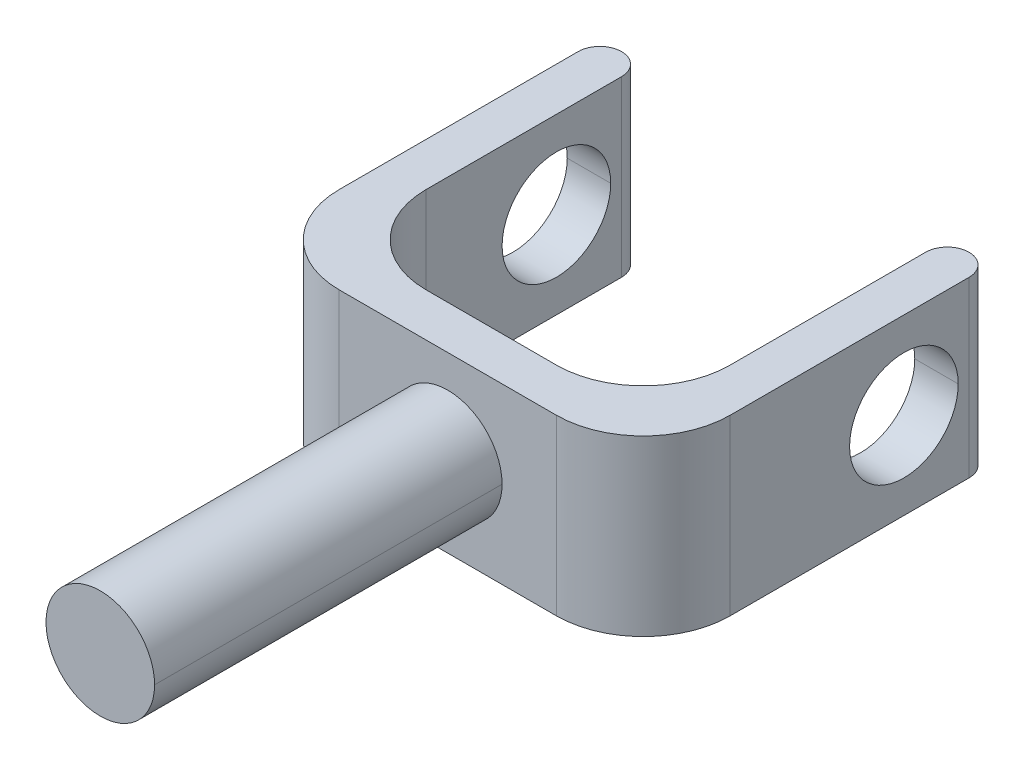
ISO-10303-21;
HEADER;
FILE_DESCRIPTION(('STEP AP214'),'2;1');
FILE_NAME('part.step','',(''),(''),'','','');
FILE_SCHEMA(('AUTOMOTIVE_DESIGN { 1 0 10303 214 1 1 1 1 }'));
ENDSEC;
DATA;
#1=APPLICATION_CONTEXT('core data for automotive mechanical design processes');
#2=APPLICATION_PROTOCOL_DEFINITION('international standard','automotive_design',2000,#1);
#3=PRODUCT_CONTEXT('',#1,'mechanical');
#4=PRODUCT('Part','Part','',(#3));
#5=PRODUCT_RELATED_PRODUCT_CATEGORY('part','',(#4));
#6=PRODUCT_DEFINITION_FORMATION('','',#4);
#7=PRODUCT_DEFINITION_CONTEXT('part definition',#1,'design');
#8=PRODUCT_DEFINITION('design','',#6,#7);
#9=PRODUCT_DEFINITION_SHAPE('','',#8);
#10=(LENGTH_UNIT() NAMED_UNIT(*) SI_UNIT(.MILLI.,.METRE.));
#11=(NAMED_UNIT(*) PLANE_ANGLE_UNIT() SI_UNIT($,.RADIAN.));
#12=(NAMED_UNIT(*) SI_UNIT($,.STERADIAN.) SOLID_ANGLE_UNIT());
#13=UNCERTAINTY_MEASURE_WITH_UNIT(LENGTH_MEASURE(1.E-05),#10,'distance_accuracy_value','');
#14=(GEOMETRIC_REPRESENTATION_CONTEXT(3) GLOBAL_UNCERTAINTY_ASSIGNED_CONTEXT((#13)) GLOBAL_UNIT_ASSIGNED_CONTEXT((#10,
#11,#12)) REPRESENTATION_CONTEXT('',''));
#15=CARTESIAN_POINT('',(0.,0.,0.));
#16=DIRECTION('',(0.,0.,1.));
#17=DIRECTION('',(1.,0.,0.));
#18=AXIS2_PLACEMENT_3D('',#15,#16,#17);
#19=CARTESIAN_POINT('',(-45.,0.,-55.));
#20=DIRECTION('',(1.,0.,0.));
#21=DIRECTION('',(0.,0.,-1.));
#22=AXIS2_PLACEMENT_3D('',#19,#20,#21);
#23=CYLINDRICAL_SURFACE('',#22,12.5);
#24=CARTESIAN_POINT('',(-45.,0.,-55.));
#25=DIRECTION('',(1.,0.,0.));
#26=DIRECTION('',(0.,0.,-1.));
#27=AXIS2_PLACEMENT_3D('',#24,#25,#26);
#28=CIRCLE('',#27,12.5);
#29=CARTESIAN_POINT('',(-45.,0.,-42.5));
#30=VERTEX_POINT('',#29);
#31=CARTESIAN_POINT('',(-45.,0.,-67.5));
#32=VERTEX_POINT('',#31);
#33=EDGE_CURVE('E295',#30,#32,#28,.T.);
#34=ORIENTED_EDGE('',*,*,#33,.F.);
#35=DIRECTION('',(1.,0.,0.));
#36=VECTOR('',#35,1.);
#37=CARTESIAN_POINT('',(-45.,0.,-42.5));
#38=LINE('',#37,#36);
#39=CARTESIAN_POINT('',(-35.,0.,-42.5));
#40=VERTEX_POINT('',#39);
#41=EDGE_CURVE('E379',#30,#40,#38,.T.);
#42=ORIENTED_EDGE('',*,*,#41,.T.);
#43=CARTESIAN_POINT('',(-35.,0.,-55.));
#44=DIRECTION('',(-1.,0.,0.));
#45=DIRECTION('',(0.,0.,1.));
#46=AXIS2_PLACEMENT_3D('',#43,#44,#45);
#47=CIRCLE('',#46,12.5);
#48=CARTESIAN_POINT('',(-35.,0.,-67.5));
#49=VERTEX_POINT('',#48);
#50=EDGE_CURVE('E9',#49,#40,#47,.T.);
#51=ORIENTED_EDGE('',*,*,#50,.F.);
#52=DIRECTION('',(1.,0.,0.));
#53=VECTOR('',#52,1.);
#54=CARTESIAN_POINT('',(-45.,0.,-67.5));
#55=LINE('',#54,#53);
#56=EDGE_CURVE('E321',#32,#49,#55,.T.);
#57=ORIENTED_EDGE('',*,*,#56,.F.);
#58=EDGE_LOOP('',(#34,#42,#51,#57));
#59=FACE_BOUND('',#58,.T.);
#60=ADVANCED_FACE('F15',(#59),#23,.F.);
#61=CARTESIAN_POINT('',(-45.,0.,-55.));
#62=DIRECTION('',(1.,0.,0.));
#63=DIRECTION('',(0.,0.,-1.));
#64=AXIS2_PLACEMENT_3D('',#61,#62,#63);
#65=CYLINDRICAL_SURFACE('',#64,12.5);
#66=CARTESIAN_POINT('',(35.,0.,-55.));
#67=DIRECTION('',(-1.,0.,0.));
#68=DIRECTION('',(0.,0.,1.));
#69=AXIS2_PLACEMENT_3D('',#66,#67,#68);
#70=CIRCLE('',#69,12.5);
#71=CARTESIAN_POINT('',(35.,0.,-67.5));
#72=VERTEX_POINT('',#71);
#73=CARTESIAN_POINT('',(35.,0.,-42.5));
#74=VERTEX_POINT('',#73);
#75=EDGE_CURVE('E252',#72,#74,#70,.T.);
#76=ORIENTED_EDGE('',*,*,#75,.T.);
#77=DIRECTION('',(1.,0.,0.));
#78=VECTOR('',#77,1.);
#79=CARTESIAN_POINT('',(-45.,0.,-42.5));
#80=LINE('',#79,#78);
#81=CARTESIAN_POINT('',(45.,0.,-42.5));
#82=VERTEX_POINT('',#81);
#83=EDGE_CURVE('E282',#74,#82,#80,.T.);
#84=ORIENTED_EDGE('',*,*,#83,.T.);
#85=CARTESIAN_POINT('',(45.,0.,-55.));
#86=DIRECTION('',(1.,0.,0.));
#87=DIRECTION('',(0.,0.,-1.));
#88=AXIS2_PLACEMENT_3D('',#85,#86,#87);
#89=CIRCLE('',#88,12.5);
#90=CARTESIAN_POINT('',(45.,0.,-67.5));
#91=VERTEX_POINT('',#90);
#92=EDGE_CURVE('E201',#82,#91,#89,.T.);
#93=ORIENTED_EDGE('',*,*,#92,.T.);
#94=DIRECTION('',(1.,0.,0.));
#95=VECTOR('',#94,1.);
#96=CARTESIAN_POINT('',(-45.,0.,-67.5));
#97=LINE('',#96,#95);
#98=EDGE_CURVE('E317',#72,#91,#97,.T.);
#99=ORIENTED_EDGE('',*,*,#98,.F.);
#100=EDGE_LOOP('',(#76,#84,#93,#99));
#101=FACE_BOUND('',#100,.T.);
#102=ADVANCED_FACE('F450',(#101),#65,.F.);
#103=CARTESIAN_POINT('',(0.,0.,85.));
#104=DIRECTION('',(0.,0.,-1.));
#105=DIRECTION('',(-1.,0.,0.));
#106=AXIS2_PLACEMENT_3D('',#103,#104,#105);
#107=CYLINDRICAL_SURFACE('',#106,12.5);
#108=CARTESIAN_POINT('',(0.,0.,85.));
#109=DIRECTION('',(0.,0.,1.));
#110=DIRECTION('',(1.,0.,0.));
#111=AXIS2_PLACEMENT_3D('',#108,#109,#110);
#112=CIRCLE('',#111,12.5);
#113=CARTESIAN_POINT('',(12.5,0.,85.));
#114=VERTEX_POINT('',#113);
#115=CARTESIAN_POINT('',(-12.5,0.,85.));
#116=VERTEX_POINT('',#115);
#117=EDGE_CURVE('E242',#114,#116,#112,.T.);
#118=ORIENTED_EDGE('',*,*,#117,.F.);
#119=DIRECTION('',(0.,0.,-1.));
#120=VECTOR('',#119,1.);
#121=CARTESIAN_POINT('',(12.5,0.,85.));
#122=LINE('',#121,#120);
#123=CARTESIAN_POINT('',(12.5,0.,5.));
#124=VERTEX_POINT('',#123);
#125=EDGE_CURVE('E270',#114,#124,#122,.T.);
#126=ORIENTED_EDGE('',*,*,#125,.T.);
#127=CARTESIAN_POINT('',(0.,0.,5.));
#128=DIRECTION('',(0.,0.,1.));
#129=DIRECTION('',(1.,0.,0.));
#130=AXIS2_PLACEMENT_3D('',#127,#128,#129);
#131=CIRCLE('',#130,12.5);
#132=CARTESIAN_POINT('',(-12.5,0.,5.));
#133=VERTEX_POINT('',#132);
#134=EDGE_CURVE('E231',#124,#133,#131,.T.);
#135=ORIENTED_EDGE('',*,*,#134,.T.);
#136=DIRECTION('',(0.,0.,-1.));
#137=VECTOR('',#136,1.);
#138=CARTESIAN_POINT('',(-12.5,0.,85.));
#139=LINE('',#138,#137);
#140=EDGE_CURVE('E248',#116,#133,#139,.T.);
#141=ORIENTED_EDGE('',*,*,#140,.F.);
#142=EDGE_LOOP('',(#118,#126,#135,#141));
#143=FACE_BOUND('',#142,.T.);
#144=ADVANCED_FACE('F610',(#143),#107,.T.);
#145=CARTESIAN_POINT('',(40.,20.,-70.));
#146=DIRECTION('',(0.,-1.,0.));
#147=DIRECTION('',(0.,0.,-1.));
#148=AXIS2_PLACEMENT_3D('',#145,#146,#147);
#149=CYLINDRICAL_SURFACE('',#148,5.);
#150=CARTESIAN_POINT('',(40.,20.,-70.));
#151=DIRECTION('',(0.,-1.,0.));
#152=DIRECTION('',(0.,0.,1.));
#153=AXIS2_PLACEMENT_3D('',#150,#151,#152);
#154=CIRCLE('',#153,5.);
#155=CARTESIAN_POINT('',(35.,20.,-70.));
#156=VERTEX_POINT('',#155);
#157=CARTESIAN_POINT('',(40.,20.,-75.));
#158=VERTEX_POINT('',#157);
#159=EDGE_CURVE('E211',#156,#158,#154,.T.);
#160=ORIENTED_EDGE('',*,*,#159,.T.);
#161=DIRECTION('',(0.,-1.,0.));
#162=VECTOR('',#161,1.);
#163=CARTESIAN_POINT('',(40.,20.,-75.));
#164=LINE('',#163,#162);
#165=CARTESIAN_POINT('',(40.,-20.,-75.));
#166=VERTEX_POINT('',#165);
#167=EDGE_CURVE('E202',#158,#166,#164,.T.);
#168=ORIENTED_EDGE('',*,*,#167,.T.);
#169=CARTESIAN_POINT('',(40.,-20.,-70.));
#170=DIRECTION('',(0.,-1.,0.));
#171=DIRECTION('',(0.,0.,1.));
#172=AXIS2_PLACEMENT_3D('',#169,#170,#171);
#173=CIRCLE('',#172,5.);
#174=CARTESIAN_POINT('',(35.,-20.,-70.));
#175=VERTEX_POINT('',#174);
#176=EDGE_CURVE('E307',#175,#166,#173,.T.);
#177=ORIENTED_EDGE('',*,*,#176,.F.);
#178=DIRECTION('',(0.,-1.,0.));
#179=VECTOR('',#178,1.);
#180=CARTESIAN_POINT('',(35.,20.,-70.));
#181=LINE('',#180,#179);
#182=EDGE_CURVE('E249',#156,#175,#181,.T.);
#183=ORIENTED_EDGE('',*,*,#182,.F.);
#184=EDGE_LOOP('',(#160,#168,#177,#183));
#185=FACE_BOUND('',#184,.T.);
#186=ADVANCED_FACE('F664',(#185),#149,.T.);
#187=CARTESIAN_POINT('',(-40.,20.,-70.));
#188=DIRECTION('',(0.,-1.,0.));
#189=DIRECTION('',(0.,0.,-1.));
#190=AXIS2_PLACEMENT_3D('',#187,#188,#189);
#191=CYLINDRICAL_SURFACE('',#190,5.);
#192=CARTESIAN_POINT('',(-40.,20.,-70.));
#193=DIRECTION('',(0.,1.,0.));
#194=DIRECTION('',(0.,0.,1.));
#195=AXIS2_PLACEMENT_3D('',#192,#193,#194);
#196=CIRCLE('',#195,5.);
#197=CARTESIAN_POINT('',(-40.,20.,-75.));
#198=VERTEX_POINT('',#197);
#199=CARTESIAN_POINT('',(-45.,20.,-70.));
#200=VERTEX_POINT('',#199);
#201=EDGE_CURVE('E265',#198,#200,#196,.T.);
#202=ORIENTED_EDGE('',*,*,#201,.F.);
#203=DIRECTION('',(0.,-1.,0.));
#204=VECTOR('',#203,1.);
#205=CARTESIAN_POINT('',(-40.,20.,-75.));
#206=LINE('',#205,#204);
#207=CARTESIAN_POINT('',(-40.,-20.,-75.));
#208=VERTEX_POINT('',#207);
#209=EDGE_CURVE('E293',#198,#208,#206,.T.);
#210=ORIENTED_EDGE('',*,*,#209,.T.);
#211=CARTESIAN_POINT('',(-40.,-20.,-70.));
#212=DIRECTION('',(0.,1.,0.));
#213=DIRECTION('',(0.,0.,1.));
#214=AXIS2_PLACEMENT_3D('',#211,#212,#213);
#215=CIRCLE('',#214,5.);
#216=CARTESIAN_POINT('',(-45.,-20.,-70.));
#217=VERTEX_POINT('',#216);
#218=EDGE_CURVE('E302',#208,#217,#215,.T.);
#219=ORIENTED_EDGE('',*,*,#218,.T.);
#220=DIRECTION('',(0.,-1.,0.));
#221=VECTOR('',#220,1.);
#222=CARTESIAN_POINT('',(-45.,20.,-70.));
#223=LINE('',#222,#221);
#224=EDGE_CURVE('E41',#200,#217,#223,.T.);
#225=ORIENTED_EDGE('',*,*,#224,.F.);
#226=EDGE_LOOP('',(#202,#210,#219,#225));
#227=FACE_BOUND('',#226,.T.);
#228=ADVANCED_FACE('F670',(#227),#191,.T.);
#229=CARTESIAN_POINT('',(-35.,20.,0.));
#230=DIRECTION('',(-1.,0.,0.));
#231=DIRECTION('',(0.,0.,1.));
#232=AXIS2_PLACEMENT_3D('',#229,#230,#231);
#233=PLANE('',#232);
#234=ORIENTED_EDGE('',*,*,#50,.T.);
#235=CARTESIAN_POINT('',(-35.,0.,-55.));
#236=DIRECTION('',(-1.,0.,0.));
#237=DIRECTION('',(0.,0.,1.));
#238=AXIS2_PLACEMENT_3D('',#235,#236,#237);
#239=CIRCLE('',#238,12.5);
#240=EDGE_CURVE('E287',#40,#49,#239,.T.);
#241=ORIENTED_EDGE('',*,*,#240,.T.);
#242=EDGE_LOOP('',(#234,#241));
#243=FACE_BOUND('',#242,.T.);
#244=DIRECTION('',(0.,0.,-1.));
#245=VECTOR('',#244,1.);
#246=CARTESIAN_POINT('',(-35.,20.,0.));
#247=LINE('',#246,#245);
#248=CARTESIAN_POINT('',(-35.,20.,-25.));
#249=VERTEX_POINT('',#248);
#250=CARTESIAN_POINT('',(-35.,20.,-70.));
#251=VERTEX_POINT('',#250);
#252=EDGE_CURVE('E306',#249,#251,#247,.T.);
#253=ORIENTED_EDGE('',*,*,#252,.F.);
#254=DIRECTION('',(0.,-1.,0.));
#255=VECTOR('',#254,1.);
#256=CARTESIAN_POINT('',(-35.,20.,-25.));
#257=LINE('',#256,#255);
#258=CARTESIAN_POINT('',(-35.,-20.,-25.));
#259=VERTEX_POINT('',#258);
#260=EDGE_CURVE('E236',#249,#259,#257,.T.);
#261=ORIENTED_EDGE('',*,*,#260,.T.);
#262=DIRECTION('',(0.,0.,-1.));
#263=VECTOR('',#262,1.);
#264=CARTESIAN_POINT('',(-35.,-20.,0.));
#265=LINE('',#264,#263);
#266=CARTESIAN_POINT('',(-35.,-20.,-70.));
#267=VERTEX_POINT('',#266);
#268=EDGE_CURVE('E138',#259,#267,#265,.T.);
#269=ORIENTED_EDGE('',*,*,#268,.T.);
#270=DIRECTION('',(0.,-1.,0.));
#271=VECTOR('',#270,1.);
#272=CARTESIAN_POINT('',(-35.,20.,-70.));
#273=LINE('',#272,#271);
#274=EDGE_CURVE('E26',#251,#267,#273,.T.);
#275=ORIENTED_EDGE('',*,*,#274,.F.);
#276=EDGE_LOOP('',(#253,#261,#269,#275));
#277=FACE_BOUND('',#276,.T.);
#278=ADVANCED_FACE('F369',(#243,#277),#233,.F.);
#279=CARTESIAN_POINT('',(-40.,20.,-70.));
#280=DIRECTION('',(0.,-1.,0.));
#281=DIRECTION('',(0.,0.,-1.));
#282=AXIS2_PLACEMENT_3D('',#279,#280,#281);
#283=CYLINDRICAL_SURFACE('',#282,5.);
#284=ORIENTED_EDGE('',*,*,#209,.F.);
#285=CARTESIAN_POINT('',(-40.,20.,-70.));
#286=DIRECTION('',(0.,1.,0.));
#287=DIRECTION('',(0.,0.,1.));
#288=AXIS2_PLACEMENT_3D('',#285,#286,#287);
#289=CIRCLE('',#288,5.);
#290=EDGE_CURVE('E269',#251,#198,#289,.T.);
#291=ORIENTED_EDGE('',*,*,#290,.F.);
#292=ORIENTED_EDGE('',*,*,#274,.T.);
#293=CARTESIAN_POINT('',(-40.,-20.,-70.));
#294=DIRECTION('',(0.,1.,0.));
#295=DIRECTION('',(0.,0.,1.));
#296=AXIS2_PLACEMENT_3D('',#293,#294,#295);
#297=CIRCLE('',#296,5.);
#298=EDGE_CURVE('E281',#267,#208,#297,.T.);
#299=ORIENTED_EDGE('',*,*,#298,.T.);
#300=EDGE_LOOP('',(#284,#291,#292,#299));
#301=FACE_BOUND('',#300,.T.);
#302=ADVANCED_FACE('F579',(#301),#283,.T.);
#303=CARTESIAN_POINT('',(-45.,20.,0.));
#304=DIRECTION('',(-1.,0.,0.));
#305=DIRECTION('',(0.,0.,1.));
#306=AXIS2_PLACEMENT_3D('',#303,#304,#305);
#307=PLANE('',#306);
#308=CARTESIAN_POINT('',(-45.,0.,-55.));
#309=DIRECTION('',(1.,0.,0.));
#310=DIRECTION('',(0.,0.,-1.));
#311=AXIS2_PLACEMENT_3D('',#308,#309,#310);
#312=CIRCLE('',#311,12.5);
#313=EDGE_CURVE('E325',#32,#30,#312,.T.);
#314=ORIENTED_EDGE('',*,*,#313,.T.);
#315=ORIENTED_EDGE('',*,*,#33,.T.);
#316=EDGE_LOOP('',(#314,#315));
#317=FACE_BOUND('',#316,.T.);
#318=DIRECTION('',(0.,0.,-1.));
#319=VECTOR('',#318,1.);
#320=CARTESIAN_POINT('',(-45.,-20.,0.));
#321=LINE('',#320,#319);
#322=CARTESIAN_POINT('',(-45.,-20.,-15.));
#323=VERTEX_POINT('',#322);
#324=EDGE_CURVE('E257',#323,#217,#321,.T.);
#325=ORIENTED_EDGE('',*,*,#324,.F.);
#326=DIRECTION('',(0.,1.,0.));
#327=VECTOR('',#326,1.);
#328=CARTESIAN_POINT('',(-45.,20.,-15.));
#329=LINE('',#328,#327);
#330=CARTESIAN_POINT('',(-45.,20.,-15.));
#331=VERTEX_POINT('',#330);
#332=EDGE_CURVE('E359',#323,#331,#329,.T.);
#333=ORIENTED_EDGE('',*,*,#332,.T.);
#334=DIRECTION('',(0.,0.,-1.));
#335=VECTOR('',#334,1.);
#336=CARTESIAN_POINT('',(-45.,20.,0.));
#337=LINE('',#336,#335);
#338=EDGE_CURVE('E253',#331,#200,#337,.T.);
#339=ORIENTED_EDGE('',*,*,#338,.T.);
#340=ORIENTED_EDGE('',*,*,#224,.T.);
#341=EDGE_LOOP('',(#325,#333,#339,#340));
#342=FACE_BOUND('',#341,.T.);
#343=ADVANCED_FACE('F574',(#317,#342),#307,.T.);
#344=CARTESIAN_POINT('',(0.,20.,5.));
#345=DIRECTION('',(0.,0.,-1.));
#346=DIRECTION('',(0.,-1.,0.));
#347=AXIS2_PLACEMENT_3D('',#344,#345,#346);
#348=PLANE('',#347);
#349=CARTESIAN_POINT('',(0.,0.,5.));
#350=DIRECTION('',(0.,0.,1.));
#351=DIRECTION('',(1.,0.,0.));
#352=AXIS2_PLACEMENT_3D('',#349,#350,#351);
#353=CIRCLE('',#352,12.5);
#354=EDGE_CURVE('E244',#133,#124,#353,.T.);
#355=ORIENTED_EDGE('',*,*,#354,.F.);
#356=ORIENTED_EDGE('',*,*,#134,.F.);
#357=EDGE_LOOP('',(#355,#356));
#358=FACE_BOUND('',#357,.T.);
#359=DIRECTION('',(1.,0.,0.));
#360=VECTOR('',#359,1.);
#361=CARTESIAN_POINT('',(0.,-20.,5.));
#362=LINE('',#361,#360);
#363=CARTESIAN_POINT('',(-25.,-20.,5.));
#364=VERTEX_POINT('',#363);
#365=CARTESIAN_POINT('',(25.,-20.,5.));
#366=VERTEX_POINT('',#365);
#367=EDGE_CURVE('E254',#364,#366,#362,.T.);
#368=ORIENTED_EDGE('',*,*,#367,.T.);
#369=DIRECTION('',(0.,1.,0.));
#370=VECTOR('',#369,1.);
#371=CARTESIAN_POINT('',(25.,20.,5.));
#372=LINE('',#371,#370);
#373=CARTESIAN_POINT('',(25.,20.,5.));
#374=VERTEX_POINT('',#373);
#375=EDGE_CURVE('E19',#366,#374,#372,.T.);
#376=ORIENTED_EDGE('',*,*,#375,.T.);
#377=DIRECTION('',(1.,0.,0.));
#378=VECTOR('',#377,1.);
#379=CARTESIAN_POINT('',(0.,20.,5.));
#380=LINE('',#379,#378);
#381=CARTESIAN_POINT('',(-25.,20.,5.));
#382=VERTEX_POINT('',#381);
#383=EDGE_CURVE('E218',#382,#374,#380,.T.);
#384=ORIENTED_EDGE('',*,*,#383,.F.);
#385=DIRECTION('',(0.,-1.,0.));
#386=VECTOR('',#385,1.);
#387=CARTESIAN_POINT('',(-25.,-20.,5.));
#388=LINE('',#387,#386);
#389=EDGE_CURVE('E292',#382,#364,#388,.T.);
#390=ORIENTED_EDGE('',*,*,#389,.T.);
#391=EDGE_LOOP('',(#368,#376,#384,#390));
#392=FACE_BOUND('',#391,.T.);
#393=ADVANCED_FACE('F578',(#358,#392),#348,.F.);
#394=CARTESIAN_POINT('',(45.,20.,0.));
#395=DIRECTION('',(-1.,0.,0.));
#396=DIRECTION('',(0.,1.,0.));
#397=AXIS2_PLACEMENT_3D('',#394,#395,#396);
#398=PLANE('',#397);
#399=CARTESIAN_POINT('',(45.,0.,-55.));
#400=DIRECTION('',(1.,0.,0.));
#401=DIRECTION('',(0.,0.,-1.));
#402=AXIS2_PLACEMENT_3D('',#399,#400,#401);
#403=CIRCLE('',#402,12.5);
#404=EDGE_CURVE('E312',#91,#82,#403,.T.);
#405=ORIENTED_EDGE('',*,*,#404,.F.);
#406=ORIENTED_EDGE('',*,*,#92,.F.);
#407=EDGE_LOOP('',(#405,#406));
#408=FACE_BOUND('',#407,.T.);
#409=DIRECTION('',(0.,0.,-1.));
#410=VECTOR('',#409,1.);
#411=CARTESIAN_POINT('',(45.,20.,0.));
#412=LINE('',#411,#410);
#413=CARTESIAN_POINT('',(45.,20.,-15.));
#414=VERTEX_POINT('',#413);
#415=CARTESIAN_POINT('',(45.,20.,-70.));
#416=VERTEX_POINT('',#415);
#417=EDGE_CURVE('E194',#414,#416,#412,.T.);
#418=ORIENTED_EDGE('',*,*,#417,.F.);
#419=DIRECTION('',(0.,-1.,0.));
#420=VECTOR('',#419,1.);
#421=CARTESIAN_POINT('',(45.,20.,-15.));
#422=LINE('',#421,#420);
#423=CARTESIAN_POINT('',(45.,-20.,-15.));
#424=VERTEX_POINT('',#423);
#425=EDGE_CURVE('E274',#414,#424,#422,.T.);
#426=ORIENTED_EDGE('',*,*,#425,.T.);
#427=DIRECTION('',(0.,0.,-1.));
#428=VECTOR('',#427,1.);
#429=CARTESIAN_POINT('',(45.,-20.,0.));
#430=LINE('',#429,#428);
#431=CARTESIAN_POINT('',(45.,-20.,-70.));
#432=VERTEX_POINT('',#431);
#433=EDGE_CURVE('E196',#424,#432,#430,.T.);
#434=ORIENTED_EDGE('',*,*,#433,.T.);
#435=DIRECTION('',(0.,-1.,0.));
#436=VECTOR('',#435,1.);
#437=CARTESIAN_POINT('',(45.,20.,-70.));
#438=LINE('',#437,#436);
#439=EDGE_CURVE('E189',#416,#432,#438,.T.);
#440=ORIENTED_EDGE('',*,*,#439,.F.);
#441=EDGE_LOOP('',(#418,#426,#434,#440));
#442=FACE_BOUND('',#441,.T.);
#443=ADVANCED_FACE('F191',(#408,#442),#398,.F.);
#444=CARTESIAN_POINT('',(40.,20.,-70.));
#445=DIRECTION('',(0.,-1.,0.));
#446=DIRECTION('',(0.,0.,-1.));
#447=AXIS2_PLACEMENT_3D('',#444,#445,#446);
#448=CYLINDRICAL_SURFACE('',#447,5.);
#449=ORIENTED_EDGE('',*,*,#167,.F.);
#450=CARTESIAN_POINT('',(40.,20.,-70.));
#451=DIRECTION('',(0.,-1.,0.));
#452=DIRECTION('',(0.,0.,1.));
#453=AXIS2_PLACEMENT_3D('',#450,#451,#452);
#454=CIRCLE('',#453,5.);
#455=EDGE_CURVE('E205',#158,#416,#454,.T.);
#456=ORIENTED_EDGE('',*,*,#455,.T.);
#457=ORIENTED_EDGE('',*,*,#439,.T.);
#458=CARTESIAN_POINT('',(40.,-20.,-70.));
#459=DIRECTION('',(0.,-1.,0.));
#460=DIRECTION('',(0.,0.,1.));
#461=AXIS2_PLACEMENT_3D('',#458,#459,#460);
#462=CIRCLE('',#461,5.);
#463=EDGE_CURVE('E225',#166,#432,#462,.T.);
#464=ORIENTED_EDGE('',*,*,#463,.F.);
#465=EDGE_LOOP('',(#449,#456,#457,#464));
#466=FACE_BOUND('',#465,.T.);
#467=ADVANCED_FACE('F206',(#466),#448,.T.);
#468=CARTESIAN_POINT('',(35.,20.,0.));
#469=DIRECTION('',(-1.,0.,0.));
#470=DIRECTION('',(0.,0.,1.));
#471=AXIS2_PLACEMENT_3D('',#468,#469,#470);
#472=PLANE('',#471);
#473=ORIENTED_EDGE('',*,*,#75,.F.);
#474=CARTESIAN_POINT('',(35.,0.,-55.));
#475=DIRECTION('',(-1.,0.,0.));
#476=DIRECTION('',(0.,0.,1.));
#477=AXIS2_PLACEMENT_3D('',#474,#475,#476);
#478=CIRCLE('',#477,12.5);
#479=EDGE_CURVE('E286',#74,#72,#478,.T.);
#480=ORIENTED_EDGE('',*,*,#479,.F.);
#481=EDGE_LOOP('',(#473,#480));
#482=FACE_BOUND('',#481,.T.);
#483=DIRECTION('',(0.,0.,-1.));
#484=VECTOR('',#483,1.);
#485=CARTESIAN_POINT('',(35.,-20.,0.));
#486=LINE('',#485,#484);
#487=CARTESIAN_POINT('',(35.,-20.,-25.));
#488=VERTEX_POINT('',#487);
#489=EDGE_CURVE('E311',#488,#175,#486,.T.);
#490=ORIENTED_EDGE('',*,*,#489,.F.);
#491=DIRECTION('',(0.,1.,0.));
#492=VECTOR('',#491,1.);
#493=CARTESIAN_POINT('',(35.,20.,-25.));
#494=LINE('',#493,#492);
#495=CARTESIAN_POINT('',(35.,20.,-25.));
#496=VERTEX_POINT('',#495);
#497=EDGE_CURVE('E229',#488,#496,#494,.T.);
#498=ORIENTED_EDGE('',*,*,#497,.T.);
#499=DIRECTION('',(0.,0.,-1.));
#500=VECTOR('',#499,1.);
#501=CARTESIAN_POINT('',(35.,20.,0.));
#502=LINE('',#501,#500);
#503=EDGE_CURVE('E258',#496,#156,#502,.T.);
#504=ORIENTED_EDGE('',*,*,#503,.T.);
#505=ORIENTED_EDGE('',*,*,#182,.T.);
#506=EDGE_LOOP('',(#490,#498,#504,#505));
#507=FACE_BOUND('',#506,.T.);
#508=ADVANCED_FACE('F460',(#482,#507),#472,.T.);
#509=CARTESIAN_POINT('',(0.,20.,-5.));
#510=DIRECTION('',(0.,0.,-1.));
#511=DIRECTION('',(0.,-1.,0.));
#512=AXIS2_PLACEMENT_3D('',#509,#510,#511);
#513=PLANE('',#512);
#514=DIRECTION('',(1.,0.,0.));
#515=VECTOR('',#514,1.);
#516=CARTESIAN_POINT('',(0.,20.,-5.));
#517=LINE('',#516,#515);
#518=CARTESIAN_POINT('',(-15.,20.,-5.));
#519=VERTEX_POINT('',#518);
#520=CARTESIAN_POINT('',(15.,20.,-5.));
#521=VERTEX_POINT('',#520);
#522=EDGE_CURVE('E262',#519,#521,#517,.T.);
#523=ORIENTED_EDGE('',*,*,#522,.T.);
#524=DIRECTION('',(0.,-1.,0.));
#525=VECTOR('',#524,1.);
#526=CARTESIAN_POINT('',(15.,-20.,-5.));
#527=LINE('',#526,#525);
#528=CARTESIAN_POINT('',(15.,-20.,-5.));
#529=VERTEX_POINT('',#528);
#530=EDGE_CURVE('E243',#521,#529,#527,.T.);
#531=ORIENTED_EDGE('',*,*,#530,.T.);
#532=DIRECTION('',(1.,0.,0.));
#533=VECTOR('',#532,1.);
#534=CARTESIAN_POINT('',(0.,-20.,-5.));
#535=LINE('',#534,#533);
#536=CARTESIAN_POINT('',(-15.,-20.,-5.));
#537=VERTEX_POINT('',#536);
#538=EDGE_CURVE('E125',#537,#529,#535,.T.);
#539=ORIENTED_EDGE('',*,*,#538,.F.);
#540=DIRECTION('',(0.,1.,0.));
#541=VECTOR('',#540,1.);
#542=CARTESIAN_POINT('',(-15.,20.,-5.));
#543=LINE('',#542,#541);
#544=EDGE_CURVE('E237',#537,#519,#543,.T.);
#545=ORIENTED_EDGE('',*,*,#544,.T.);
#546=EDGE_LOOP('',(#523,#531,#539,#545));
#547=FACE_BOUND('',#546,.T.);
#548=ADVANCED_FACE('F334',(#547),#513,.T.);
#549=CARTESIAN_POINT('',(0.,20.,0.));
#550=DIRECTION('',(0.,1.,0.));
#551=DIRECTION('',(1.,0.,0.));
#552=AXIS2_PLACEMENT_3D('',#549,#550,#551);
#553=PLANE('',#552);
#554=ORIENTED_EDGE('',*,*,#383,.T.);
#555=CARTESIAN_POINT('',(25.,20.,-15.));
#556=DIRECTION('',(0.,1.,0.));
#557=DIRECTION('',(0.,0.,1.));
#558=AXIS2_PLACEMENT_3D('',#555,#556,#557);
#559=CIRCLE('',#558,20.);
#560=EDGE_CURVE('E216',#374,#414,#559,.T.);
#561=ORIENTED_EDGE('',*,*,#560,.T.);
#562=ORIENTED_EDGE('',*,*,#417,.T.);
#563=ORIENTED_EDGE('',*,*,#455,.F.);
#564=ORIENTED_EDGE('',*,*,#159,.F.);
#565=ORIENTED_EDGE('',*,*,#503,.F.);
#566=CARTESIAN_POINT('',(15.,20.,-25.));
#567=DIRECTION('',(0.,-1.,0.));
#568=DIRECTION('',(0.,0.,1.));
#569=AXIS2_PLACEMENT_3D('',#566,#567,#568);
#570=CIRCLE('',#569,20.);
#571=EDGE_CURVE('E277',#496,#521,#570,.T.);
#572=ORIENTED_EDGE('',*,*,#571,.T.);
#573=ORIENTED_EDGE('',*,*,#522,.F.);
#574=CARTESIAN_POINT('',(-15.,20.,-25.));
#575=DIRECTION('',(0.,-1.,0.));
#576=DIRECTION('',(0.,0.,1.));
#577=AXIS2_PLACEMENT_3D('',#574,#575,#576);
#578=CIRCLE('',#577,20.);
#579=EDGE_CURVE('E288',#519,#249,#578,.T.);
#580=ORIENTED_EDGE('',*,*,#579,.T.);
#581=ORIENTED_EDGE('',*,*,#252,.T.);
#582=ORIENTED_EDGE('',*,*,#290,.T.);
#583=ORIENTED_EDGE('',*,*,#201,.T.);
#584=ORIENTED_EDGE('',*,*,#338,.F.);
#585=CARTESIAN_POINT('',(-25.,20.,-15.));
#586=DIRECTION('',(0.,1.,0.));
#587=DIRECTION('',(0.,0.,1.));
#588=AXIS2_PLACEMENT_3D('',#585,#586,#587);
#589=CIRCLE('',#588,20.);
#590=EDGE_CURVE('E316',#331,#382,#589,.T.);
#591=ORIENTED_EDGE('',*,*,#590,.T.);
#592=EDGE_LOOP('',(#554,#561,#562,#563,#564,#565,#572,#573,#580,#581,#582,#583,#584,#591));
#593=FACE_BOUND('',#592,.T.);
#594=ADVANCED_FACE('F214',(#593),#553,.T.);
#595=CARTESIAN_POINT('',(0.,-20.,0.));
#596=DIRECTION('',(0.,1.,0.));
#597=DIRECTION('',(1.,0.,0.));
#598=AXIS2_PLACEMENT_3D('',#595,#596,#597);
#599=PLANE('',#598);
#600=ORIENTED_EDGE('',*,*,#433,.F.);
#601=CARTESIAN_POINT('',(25.,-20.,-15.));
#602=DIRECTION('',(0.,-1.,0.));
#603=DIRECTION('',(0.,0.,1.));
#604=AXIS2_PLACEMENT_3D('',#601,#602,#603);
#605=CIRCLE('',#604,20.);
#606=EDGE_CURVE('E278',#424,#366,#605,.T.);
#607=ORIENTED_EDGE('',*,*,#606,.T.);
#608=ORIENTED_EDGE('',*,*,#367,.F.);
#609=CARTESIAN_POINT('',(-25.,-20.,-15.));
#610=DIRECTION('',(0.,-1.,0.));
#611=DIRECTION('',(0.,0.,1.));
#612=AXIS2_PLACEMENT_3D('',#609,#610,#611);
#613=CIRCLE('',#612,20.);
#614=EDGE_CURVE('E362',#364,#323,#613,.T.);
#615=ORIENTED_EDGE('',*,*,#614,.T.);
#616=ORIENTED_EDGE('',*,*,#324,.T.);
#617=ORIENTED_EDGE('',*,*,#218,.F.);
#618=ORIENTED_EDGE('',*,*,#298,.F.);
#619=ORIENTED_EDGE('',*,*,#268,.F.);
#620=CARTESIAN_POINT('',(-15.,-20.,-25.));
#621=DIRECTION('',(0.,1.,0.));
#622=DIRECTION('',(0.,0.,1.));
#623=AXIS2_PLACEMENT_3D('',#620,#621,#622);
#624=CIRCLE('',#623,20.);
#625=EDGE_CURVE('E233',#259,#537,#624,.T.);
#626=ORIENTED_EDGE('',*,*,#625,.T.);
#627=ORIENTED_EDGE('',*,*,#538,.T.);
#628=CARTESIAN_POINT('',(15.,-20.,-25.));
#629=DIRECTION('',(0.,1.,0.));
#630=DIRECTION('',(0.,0.,1.));
#631=AXIS2_PLACEMENT_3D('',#628,#629,#630);
#632=CIRCLE('',#631,20.);
#633=EDGE_CURVE('E356',#529,#488,#632,.T.);
#634=ORIENTED_EDGE('',*,*,#633,.T.);
#635=ORIENTED_EDGE('',*,*,#489,.T.);
#636=ORIENTED_EDGE('',*,*,#176,.T.);
#637=ORIENTED_EDGE('',*,*,#463,.T.);
#638=EDGE_LOOP('',(#600,#607,#608,#615,#616,#617,#618,#619,#626,#627,#634,#635,#636,#637));
#639=FACE_BOUND('',#638,.T.);
#640=ADVANCED_FACE('F470',(#639),#599,.F.);
#641=CARTESIAN_POINT('',(0.,0.,85.));
#642=DIRECTION('',(0.,0.,-1.));
#643=DIRECTION('',(-1.,0.,0.));
#644=AXIS2_PLACEMENT_3D('',#641,#642,#643);
#645=CYLINDRICAL_SURFACE('',#644,12.5);
#646=ORIENTED_EDGE('',*,*,#125,.F.);
#647=CARTESIAN_POINT('',(0.,0.,85.));
#648=DIRECTION('',(0.,0.,1.));
#649=DIRECTION('',(1.,0.,0.));
#650=AXIS2_PLACEMENT_3D('',#647,#648,#649);
#651=CIRCLE('',#650,12.5);
#652=EDGE_CURVE('E238',#116,#114,#651,.T.);
#653=ORIENTED_EDGE('',*,*,#652,.F.);
#654=ORIENTED_EDGE('',*,*,#140,.T.);
#655=ORIENTED_EDGE('',*,*,#354,.T.);
#656=EDGE_LOOP('',(#646,#653,#654,#655));
#657=FACE_BOUND('',#656,.T.);
#658=ADVANCED_FACE('F17',(#657),#645,.T.);
#659=CARTESIAN_POINT('',(0.,0.,85.));
#660=DIRECTION('',(0.,0.,1.));
#661=DIRECTION('',(1.,0.,0.));
#662=AXIS2_PLACEMENT_3D('',#659,#660,#661);
#663=PLANE('',#662);
#664=ORIENTED_EDGE('',*,*,#652,.T.);
#665=ORIENTED_EDGE('',*,*,#117,.T.);
#666=EDGE_LOOP('',(#664,#665));
#667=FACE_BOUND('',#666,.T.);
#668=ADVANCED_FACE('F649',(#667),#663,.T.);
#669=CARTESIAN_POINT('',(15.,20.,-25.));
#670=DIRECTION('',(0.,1.,0.));
#671=DIRECTION('',(0.,0.,1.));
#672=AXIS2_PLACEMENT_3D('',#669,#670,#671);
#673=CYLINDRICAL_SURFACE('',#672,20.);
#674=ORIENTED_EDGE('',*,*,#571,.F.);
#675=ORIENTED_EDGE('',*,*,#497,.F.);
#676=ORIENTED_EDGE('',*,*,#633,.F.);
#677=ORIENTED_EDGE('',*,*,#530,.F.);
#678=EDGE_LOOP('',(#674,#675,#676,#677));
#679=FACE_BOUND('',#678,.T.);
#680=ADVANCED_FACE('F472',(#679),#673,.F.);
#681=CARTESIAN_POINT('',(25.,20.,-15.));
#682=DIRECTION('',(0.,-1.,0.));
#683=DIRECTION('',(0.,0.,-1.));
#684=AXIS2_PLACEMENT_3D('',#681,#682,#683);
#685=CYLINDRICAL_SURFACE('',#684,20.);
#686=ORIENTED_EDGE('',*,*,#560,.F.);
#687=ORIENTED_EDGE('',*,*,#375,.F.);
#688=ORIENTED_EDGE('',*,*,#606,.F.);
#689=ORIENTED_EDGE('',*,*,#425,.F.);
#690=EDGE_LOOP('',(#686,#687,#688,#689));
#691=FACE_BOUND('',#690,.T.);
#692=ADVANCED_FACE('F633',(#691),#685,.T.);
#693=CARTESIAN_POINT('',(-15.,20.,-25.));
#694=DIRECTION('',(0.,-1.,0.));
#695=DIRECTION('',(0.,0.,-1.));
#696=AXIS2_PLACEMENT_3D('',#693,#694,#695);
#697=CYLINDRICAL_SURFACE('',#696,20.);
#698=ORIENTED_EDGE('',*,*,#579,.F.);
#699=ORIENTED_EDGE('',*,*,#544,.F.);
#700=ORIENTED_EDGE('',*,*,#625,.F.);
#701=ORIENTED_EDGE('',*,*,#260,.F.);
#702=EDGE_LOOP('',(#698,#699,#700,#701));
#703=FACE_BOUND('',#702,.T.);
#704=ADVANCED_FACE('F342',(#703),#697,.F.);
#705=CARTESIAN_POINT('',(-25.,20.,-15.));
#706=DIRECTION('',(0.,1.,0.));
#707=DIRECTION('',(0.,0.,1.));
#708=AXIS2_PLACEMENT_3D('',#705,#706,#707);
#709=CYLINDRICAL_SURFACE('',#708,20.);
#710=ORIENTED_EDGE('',*,*,#590,.F.);
#711=ORIENTED_EDGE('',*,*,#332,.F.);
#712=ORIENTED_EDGE('',*,*,#614,.F.);
#713=ORIENTED_EDGE('',*,*,#389,.F.);
#714=EDGE_LOOP('',(#710,#711,#712,#713));
#715=FACE_BOUND('',#714,.T.);
#716=ADVANCED_FACE('F569',(#715),#709,.T.);
#717=CARTESIAN_POINT('',(-45.,0.,-55.));
#718=DIRECTION('',(1.,0.,0.));
#719=DIRECTION('',(0.,0.,-1.));
#720=AXIS2_PLACEMENT_3D('',#717,#718,#719);
#721=CYLINDRICAL_SURFACE('',#720,12.5);
#722=ORIENTED_EDGE('',*,*,#83,.F.);
#723=ORIENTED_EDGE('',*,*,#479,.T.);
#724=ORIENTED_EDGE('',*,*,#98,.T.);
#725=ORIENTED_EDGE('',*,*,#404,.T.);
#726=EDGE_LOOP('',(#722,#723,#724,#725));
#727=FACE_BOUND('',#726,.T.);
#728=ADVANCED_FACE('F454',(#727),#721,.F.);
#729=CARTESIAN_POINT('',(-45.,0.,-55.));
#730=DIRECTION('',(1.,0.,0.));
#731=DIRECTION('',(0.,0.,-1.));
#732=AXIS2_PLACEMENT_3D('',#729,#730,#731);
#733=CYLINDRICAL_SURFACE('',#732,12.5);
#734=ORIENTED_EDGE('',*,*,#41,.F.);
#735=ORIENTED_EDGE('',*,*,#313,.F.);
#736=ORIENTED_EDGE('',*,*,#56,.T.);
#737=ORIENTED_EDGE('',*,*,#240,.F.);
#738=EDGE_LOOP('',(#734,#735,#736,#737));
#739=FACE_BOUND('',#738,.T.);
#740=ADVANCED_FACE('F376',(#739),#733,.F.);
#741=CLOSED_SHELL('',(#60,#102,#144,#186,#228,#278,#302,#343,#393,#443,#467,#508,#548,#594,#640,
#658,#668,#680,#692,#704,#716,#728,#740));
#742=MANIFOLD_SOLID_BREP('B1',#741);
#743=ADVANCED_BREP_SHAPE_REPRESENTATION('',(#18,#742),#14);
#744=SHAPE_DEFINITION_REPRESENTATION(#9,#743);
ENDSEC;
END-ISO-10303-21;
